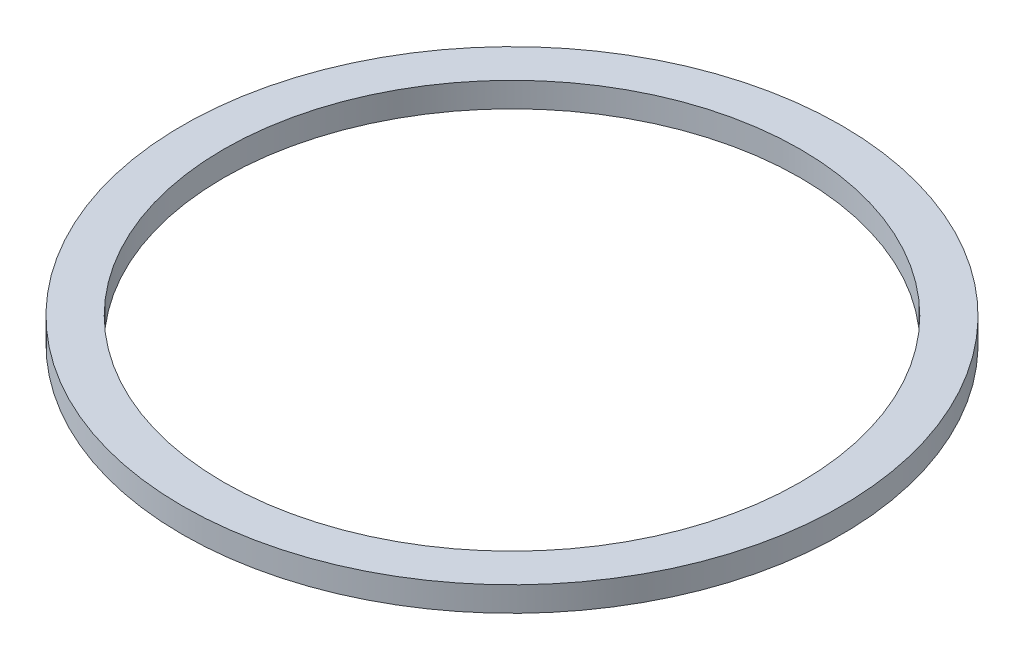
ISO-10303-21;
HEADER;
FILE_DESCRIPTION(('STEP AP214'),'2;1');
FILE_NAME('part.step','',(''),(''),'','','');
FILE_SCHEMA(('AUTOMOTIVE_DESIGN { 1 0 10303 214 1 1 1 1 }'));
ENDSEC;
DATA;
#1=APPLICATION_CONTEXT('core data for automotive mechanical design processes');
#2=APPLICATION_PROTOCOL_DEFINITION('international standard','automotive_design',2000,#1);
#3=PRODUCT_CONTEXT('',#1,'mechanical');
#4=PRODUCT('Part','Part','',(#3));
#5=PRODUCT_RELATED_PRODUCT_CATEGORY('part','',(#4));
#6=PRODUCT_DEFINITION_FORMATION('','',#4);
#7=PRODUCT_DEFINITION_CONTEXT('part definition',#1,'design');
#8=PRODUCT_DEFINITION('design','',#6,#7);
#9=PRODUCT_DEFINITION_SHAPE('','',#8);
#10=(LENGTH_UNIT() NAMED_UNIT(*) SI_UNIT(.MILLI.,.METRE.));
#11=(NAMED_UNIT(*) PLANE_ANGLE_UNIT() SI_UNIT($,.RADIAN.));
#12=(NAMED_UNIT(*) SI_UNIT($,.STERADIAN.) SOLID_ANGLE_UNIT());
#13=UNCERTAINTY_MEASURE_WITH_UNIT(LENGTH_MEASURE(1.E-05),#10,'distance_accuracy_value','');
#14=(GEOMETRIC_REPRESENTATION_CONTEXT(3) GLOBAL_UNCERTAINTY_ASSIGNED_CONTEXT((#13)) GLOBAL_UNIT_ASSIGNED_CONTEXT((#10,
#11,#12)) REPRESENTATION_CONTEXT('',''));
#15=CARTESIAN_POINT('',(0.,0.,0.));
#16=DIRECTION('',(0.,0.,1.));
#17=DIRECTION('',(1.,0.,0.));
#18=AXIS2_PLACEMENT_3D('',#15,#16,#17);
#19=CARTESIAN_POINT('',(0.,1.5,0.));
#20=DIRECTION('',(0.,1.,0.));
#21=DIRECTION('',(0.,0.,1.));
#22=AXIS2_PLACEMENT_3D('',#19,#20,#21);
#23=PLANE('',#22);
#24=CARTESIAN_POINT('',(0.,1.5,0.));
#25=DIRECTION('',(0.,1.,0.));
#26=DIRECTION('',(0.,0.,1.));
#27=AXIS2_PLACEMENT_3D('',#24,#25,#26);
#28=CIRCLE('',#27,20.);
#29=CARTESIAN_POINT('',(0.,1.5,20.));
#30=VERTEX_POINT('',#29);
#31=EDGE_CURVE('E10',#30,#30,#28,.T.);
#32=ORIENTED_EDGE('',*,*,#31,.T.);
#33=EDGE_LOOP('',(#32));
#34=FACE_BOUND('',#33,.T.);
#35=CARTESIAN_POINT('',(0.,1.5,0.));
#36=DIRECTION('',(0.,1.,0.));
#37=DIRECTION('',(0.,0.,1.));
#38=AXIS2_PLACEMENT_3D('',#35,#36,#37);
#39=CIRCLE('',#38,17.5);
#40=CARTESIAN_POINT('',(0.,1.5,17.5));
#41=VERTEX_POINT('',#40);
#42=EDGE_CURVE('E42',#41,#41,#39,.T.);
#43=ORIENTED_EDGE('',*,*,#42,.F.);
#44=EDGE_LOOP('',(#43));
#45=FACE_BOUND('',#44,.T.);
#46=ADVANCED_FACE('F31',(#34,#45),#23,.T.);
#47=CARTESIAN_POINT('',(0.,0.,0.));
#48=DIRECTION('',(0.,1.,0.));
#49=DIRECTION('',(0.,0.,1.));
#50=AXIS2_PLACEMENT_3D('',#47,#48,#49);
#51=PLANE('',#50);
#52=CARTESIAN_POINT('',(0.,0.,0.));
#53=DIRECTION('',(0.,1.,0.));
#54=DIRECTION('',(0.,0.,1.));
#55=AXIS2_PLACEMENT_3D('',#52,#53,#54);
#56=CIRCLE('',#55,20.);
#57=CARTESIAN_POINT('',(0.,0.,20.));
#58=VERTEX_POINT('',#57);
#59=EDGE_CURVE('E35',#58,#58,#56,.T.);
#60=ORIENTED_EDGE('',*,*,#59,.F.);
#61=EDGE_LOOP('',(#60));
#62=FACE_BOUND('',#61,.T.);
#63=CARTESIAN_POINT('',(0.,0.,0.));
#64=DIRECTION('',(0.,1.,0.));
#65=DIRECTION('',(0.,0.,1.));
#66=AXIS2_PLACEMENT_3D('',#63,#64,#65);
#67=CIRCLE('',#66,17.5);
#68=CARTESIAN_POINT('',(0.,0.,17.5));
#69=VERTEX_POINT('',#68);
#70=EDGE_CURVE('E44',#69,#69,#67,.T.);
#71=ORIENTED_EDGE('',*,*,#70,.T.);
#72=EDGE_LOOP('',(#71));
#73=FACE_BOUND('',#72,.T.);
#74=ADVANCED_FACE('F54',(#62,#73),#51,.F.);
#75=CARTESIAN_POINT('',(0.,1.5,0.));
#76=DIRECTION('',(0.,-1.,0.));
#77=DIRECTION('',(0.,0.,-1.));
#78=AXIS2_PLACEMENT_3D('',#75,#76,#77);
#79=CYLINDRICAL_SURFACE('',#78,20.);
#80=ORIENTED_EDGE('',*,*,#31,.F.);
#81=EDGE_LOOP('',(#80));
#82=FACE_BOUND('',#81,.T.);
#83=ORIENTED_EDGE('',*,*,#59,.T.);
#84=EDGE_LOOP('',(#83));
#85=FACE_BOUND('',#84,.T.);
#86=ADVANCED_FACE('F33',(#82,#85),#79,.T.);
#87=CARTESIAN_POINT('',(0.,1.5,0.));
#88=DIRECTION('',(0.,-1.,0.));
#89=DIRECTION('',(0.,0.,-1.));
#90=AXIS2_PLACEMENT_3D('',#87,#88,#89);
#91=CYLINDRICAL_SURFACE('',#90,17.5);
#92=ORIENTED_EDGE('',*,*,#42,.T.);
#93=EDGE_LOOP('',(#92));
#94=FACE_BOUND('',#93,.T.);
#95=ORIENTED_EDGE('',*,*,#70,.F.);
#96=EDGE_LOOP('',(#95));
#97=FACE_BOUND('',#96,.T.);
#98=ADVANCED_FACE('F50',(#94,#97),#91,.F.);
#99=CLOSED_SHELL('',(#46,#74,#86,#98));
#100=MANIFOLD_SOLID_BREP('B2',#99);
#101=ADVANCED_BREP_SHAPE_REPRESENTATION('',(#18,#100),#14);
#102=SHAPE_DEFINITION_REPRESENTATION(#9,#101);
ENDSEC;
END-ISO-10303-21;
